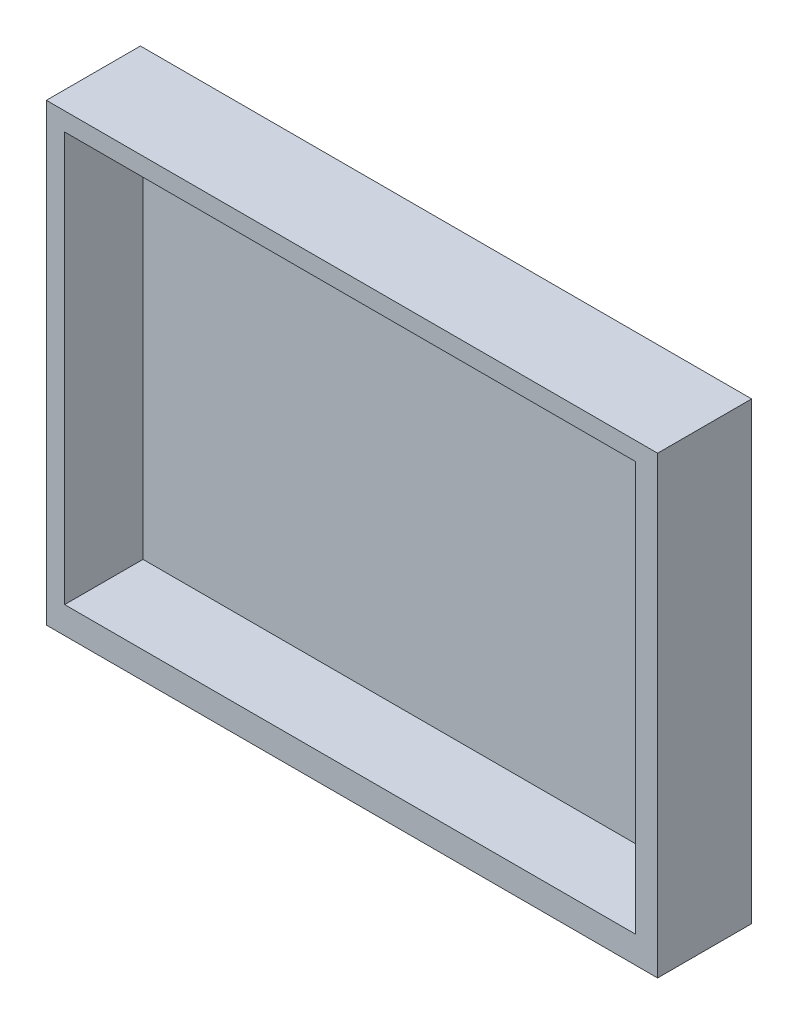
ISO-10303-21;
HEADER;
FILE_DESCRIPTION(('STEP AP214'),'2;1');
FILE_NAME('part.step','',(''),(''),'','','');
FILE_SCHEMA(('AUTOMOTIVE_DESIGN { 1 0 10303 214 1 1 1 1 }'));
ENDSEC;
DATA;
#1=APPLICATION_CONTEXT('core data for automotive mechanical design processes');
#2=APPLICATION_PROTOCOL_DEFINITION('international standard','automotive_design',2000,#1);
#3=PRODUCT_CONTEXT('',#1,'mechanical');
#4=PRODUCT('Part','Part','',(#3));
#5=PRODUCT_RELATED_PRODUCT_CATEGORY('part','',(#4));
#6=PRODUCT_DEFINITION_FORMATION('','',#4);
#7=PRODUCT_DEFINITION_CONTEXT('part definition',#1,'design');
#8=PRODUCT_DEFINITION('design','',#6,#7);
#9=PRODUCT_DEFINITION_SHAPE('','',#8);
#10=(LENGTH_UNIT() NAMED_UNIT(*) SI_UNIT(.MILLI.,.METRE.));
#11=(NAMED_UNIT(*) PLANE_ANGLE_UNIT() SI_UNIT($,.RADIAN.));
#12=(NAMED_UNIT(*) SI_UNIT($,.STERADIAN.) SOLID_ANGLE_UNIT());
#13=UNCERTAINTY_MEASURE_WITH_UNIT(LENGTH_MEASURE(1.E-05),#10,'distance_accuracy_value','');
#14=(GEOMETRIC_REPRESENTATION_CONTEXT(3) GLOBAL_UNCERTAINTY_ASSIGNED_CONTEXT((#13)) GLOBAL_UNIT_ASSIGNED_CONTEXT((#10,
#11,#12)) REPRESENTATION_CONTEXT('',''));
#15=CARTESIAN_POINT('',(0.,0.,0.));
#16=DIRECTION('',(0.,0.,1.));
#17=DIRECTION('',(1.,0.,0.));
#18=AXIS2_PLACEMENT_3D('',#15,#16,#17);
#19=CARTESIAN_POINT('',(0.,0.,0.));
#20=DIRECTION('',(0.,0.,1.));
#21=DIRECTION('',(1.,0.,0.));
#22=AXIS2_PLACEMENT_3D('',#19,#20,#21);
#23=PLANE('',#22);
#24=DIRECTION('',(0.,-1.,0.));
#25=VECTOR('',#24,1.);
#26=CARTESIAN_POINT('',(117.,0.,0.));
#27=LINE('',#26,#25);
#28=CARTESIAN_POINT('',(117.,0.,0.));
#29=VERTEX_POINT('',#28);
#30=CARTESIAN_POINT('',(117.,-87.,0.));
#31=VERTEX_POINT('',#30);
#32=EDGE_CURVE('E241',#29,#31,#27,.T.);
#33=ORIENTED_EDGE('',*,*,#32,.T.);
#34=DIRECTION('',(1.,0.,0.));
#35=VECTOR('',#34,1.);
#36=CARTESIAN_POINT('',(0.,-87.,0.));
#37=LINE('',#36,#35);
#38=CARTESIAN_POINT('',(0.,-87.,0.));
#39=VERTEX_POINT('',#38);
#40=EDGE_CURVE('E252',#39,#31,#37,.T.);
#41=ORIENTED_EDGE('',*,*,#40,.F.);
#42=DIRECTION('',(0.,-1.,0.));
#43=VECTOR('',#42,1.);
#44=CARTESIAN_POINT('',(0.,0.,0.));
#45=LINE('',#44,#43);
#46=CARTESIAN_POINT('',(0.,0.,0.));
#47=VERTEX_POINT('',#46);
#48=EDGE_CURVE('E249',#47,#39,#45,.T.);
#49=ORIENTED_EDGE('',*,*,#48,.F.);
#50=DIRECTION('',(1.,0.,0.));
#51=VECTOR('',#50,1.);
#52=CARTESIAN_POINT('',(0.,0.,0.));
#53=LINE('',#52,#51);
#54=EDGE_CURVE('E245',#47,#29,#53,.T.);
#55=ORIENTED_EDGE('',*,*,#54,.T.);
#56=EDGE_LOOP('',(#33,#41,#49,#55));
#57=FACE_BOUND('',#56,.T.);
#58=ADVANCED_FACE('F113',(#57),#23,.F.);
#59=CARTESIAN_POINT('',(0.,0.,3.));
#60=DIRECTION('',(0.,1.,0.));
#61=DIRECTION('',(0.,0.,1.));
#62=AXIS2_PLACEMENT_3D('',#59,#60,#61);
#63=PLANE('',#62);
#64=ORIENTED_EDGE('',*,*,#54,.F.);
#65=DIRECTION('',(0.,0.,-1.));
#66=VECTOR('',#65,1.);
#67=CARTESIAN_POINT('',(0.,0.,3.));
#68=LINE('',#67,#66);
#69=CARTESIAN_POINT('',(0.,0.,18.));
#70=VERTEX_POINT('',#69);
#71=EDGE_CURVE('E122',#70,#47,#68,.T.);
#72=ORIENTED_EDGE('',*,*,#71,.F.);
#73=DIRECTION('',(-1.,0.,0.));
#74=VECTOR('',#73,1.);
#75=CARTESIAN_POINT('',(0.,0.,18.));
#76=LINE('',#75,#74);
#77=CARTESIAN_POINT('',(117.,0.,18.));
#78=VERTEX_POINT('',#77);
#79=EDGE_CURVE('E237',#78,#70,#76,.T.);
#80=ORIENTED_EDGE('',*,*,#79,.F.);
#81=DIRECTION('',(0.,0.,-1.));
#82=VECTOR('',#81,1.);
#83=CARTESIAN_POINT('',(117.,0.,3.));
#84=LINE('',#83,#82);
#85=EDGE_CURVE('E12',#78,#29,#84,.T.);
#86=ORIENTED_EDGE('',*,*,#85,.T.);
#87=EDGE_LOOP('',(#64,#72,#80,#86));
#88=FACE_BOUND('',#87,.T.);
#89=ADVANCED_FACE('F272',(#88),#63,.T.);
#90=CARTESIAN_POINT('',(0.,0.,3.));
#91=DIRECTION('',(1.,0.,0.));
#92=DIRECTION('',(0.,1.,0.));
#93=AXIS2_PLACEMENT_3D('',#90,#91,#92);
#94=PLANE('',#93);
#95=ORIENTED_EDGE('',*,*,#48,.T.);
#96=DIRECTION('',(0.,0.,-1.));
#97=VECTOR('',#96,1.);
#98=CARTESIAN_POINT('',(0.,-87.,3.));
#99=LINE('',#98,#97);
#100=CARTESIAN_POINT('',(0.,-87.,18.));
#101=VERTEX_POINT('',#100);
#102=EDGE_CURVE('E259',#101,#39,#99,.T.);
#103=ORIENTED_EDGE('',*,*,#102,.F.);
#104=DIRECTION('',(0.,-1.,0.));
#105=VECTOR('',#104,1.);
#106=CARTESIAN_POINT('',(0.,0.,18.));
#107=LINE('',#106,#105);
#108=EDGE_CURVE('E194',#70,#101,#107,.T.);
#109=ORIENTED_EDGE('',*,*,#108,.F.);
#110=ORIENTED_EDGE('',*,*,#71,.T.);
#111=EDGE_LOOP('',(#95,#103,#109,#110));
#112=FACE_BOUND('',#111,.T.);
#113=ADVANCED_FACE('F266',(#112),#94,.F.);
#114=CARTESIAN_POINT('',(0.,-87.,3.));
#115=DIRECTION('',(0.,1.,0.));
#116=DIRECTION('',(0.,0.,1.));
#117=AXIS2_PLACEMENT_3D('',#114,#115,#116);
#118=PLANE('',#117);
#119=ORIENTED_EDGE('',*,*,#40,.T.);
#120=DIRECTION('',(0.,0.,-1.));
#121=VECTOR('',#120,1.);
#122=CARTESIAN_POINT('',(117.,-87.,3.));
#123=LINE('',#122,#121);
#124=CARTESIAN_POINT('',(117.,-87.,18.));
#125=VERTEX_POINT('',#124);
#126=EDGE_CURVE('E256',#125,#31,#123,.T.);
#127=ORIENTED_EDGE('',*,*,#126,.F.);
#128=DIRECTION('',(1.,0.,0.));
#129=VECTOR('',#128,1.);
#130=CARTESIAN_POINT('',(0.,-87.,18.));
#131=LINE('',#130,#129);
#132=EDGE_CURVE('E229',#101,#125,#131,.T.);
#133=ORIENTED_EDGE('',*,*,#132,.F.);
#134=ORIENTED_EDGE('',*,*,#102,.T.);
#135=EDGE_LOOP('',(#119,#127,#133,#134));
#136=FACE_BOUND('',#135,.T.);
#137=ADVANCED_FACE('F278',(#136),#118,.F.);
#138=CARTESIAN_POINT('',(117.,0.,3.));
#139=DIRECTION('',(1.,0.,0.));
#140=DIRECTION('',(0.,1.,0.));
#141=AXIS2_PLACEMENT_3D('',#138,#139,#140);
#142=PLANE('',#141);
#143=ORIENTED_EDGE('',*,*,#32,.F.);
#144=ORIENTED_EDGE('',*,*,#85,.F.);
#145=DIRECTION('',(0.,1.,0.));
#146=VECTOR('',#145,1.);
#147=CARTESIAN_POINT('',(117.,0.,18.));
#148=LINE('',#147,#146);
#149=EDGE_CURVE('E233',#125,#78,#148,.T.);
#150=ORIENTED_EDGE('',*,*,#149,.F.);
#151=ORIENTED_EDGE('',*,*,#126,.T.);
#152=EDGE_LOOP('',(#143,#144,#150,#151));
#153=FACE_BOUND('',#152,.T.);
#154=ADVANCED_FACE('F115',(#153),#142,.T.);
#155=CARTESIAN_POINT('',(0.,0.,18.));
#156=DIRECTION('',(0.,0.,1.));
#157=DIRECTION('',(1.,0.,0.));
#158=AXIS2_PLACEMENT_3D('',#155,#156,#157);
#159=PLANE('',#158);
#160=ORIENTED_EDGE('',*,*,#108,.T.);
#161=ORIENTED_EDGE('',*,*,#132,.T.);
#162=ORIENTED_EDGE('',*,*,#149,.T.);
#163=ORIENTED_EDGE('',*,*,#79,.T.);
#164=EDGE_LOOP('',(#160,#161,#162,#163));
#165=FACE_BOUND('',#164,.T.);
#166=DIRECTION('',(1.,0.,0.));
#167=VECTOR('',#166,1.);
#168=CARTESIAN_POINT('',(3.50000000000001,-81.85290245044,18.));
#169=LINE('',#168,#167);
#170=CARTESIAN_POINT('',(3.50000000000001,-81.85290245044,18.));
#171=VERTEX_POINT('',#170);
#172=CARTESIAN_POINT('',(112.779406394495,-81.85290245044,18.));
#173=VERTEX_POINT('',#172);
#174=EDGE_CURVE('E187',#171,#173,#169,.T.);
#175=ORIENTED_EDGE('',*,*,#174,.F.);
#176=DIRECTION('',(0.,-1.,0.));
#177=VECTOR('',#176,1.);
#178=CARTESIAN_POINT('',(3.5,-3.5,18.));
#179=LINE('',#178,#177);
#180=CARTESIAN_POINT('',(3.5,-3.5,18.));
#181=VERTEX_POINT('',#180);
#182=EDGE_CURVE('E177',#181,#171,#179,.T.);
#183=ORIENTED_EDGE('',*,*,#182,.F.);
#184=DIRECTION('',(-1.,0.,0.));
#185=VECTOR('',#184,1.);
#186=CARTESIAN_POINT('',(3.5,-3.5,18.));
#187=LINE('',#186,#185);
#188=CARTESIAN_POINT('',(112.779406394495,-3.5,18.));
#189=VERTEX_POINT('',#188);
#190=EDGE_CURVE('E204',#189,#181,#187,.T.);
#191=ORIENTED_EDGE('',*,*,#190,.F.);
#192=DIRECTION('',(0.,1.,0.));
#193=VECTOR('',#192,1.);
#194=CARTESIAN_POINT('',(112.779406394495,-3.5,18.));
#195=LINE('',#194,#193);
#196=EDGE_CURVE('E200',#173,#189,#195,.T.);
#197=ORIENTED_EDGE('',*,*,#196,.F.);
#198=EDGE_LOOP('',(#175,#183,#191,#197));
#199=FACE_BOUND('',#198,.T.);
#200=ADVANCED_FACE('F198',(#165,#199),#159,.T.);
#201=CARTESIAN_POINT('',(3.5,-3.5,18.));
#202=DIRECTION('',(1.,0.,0.));
#203=DIRECTION('',(0.,1.,0.));
#204=AXIS2_PLACEMENT_3D('',#201,#202,#203);
#205=PLANE('',#204);
#206=DIRECTION('',(0.,-1.,0.));
#207=VECTOR('',#206,1.);
#208=CARTESIAN_POINT('',(3.5,-3.5,3.));
#209=LINE('',#208,#207);
#210=CARTESIAN_POINT('',(3.5,-3.5,3.));
#211=VERTEX_POINT('',#210);
#212=CARTESIAN_POINT('',(3.50000000000001,-81.85290245044,3.));
#213=VERTEX_POINT('',#212);
#214=EDGE_CURVE('E129',#211,#213,#209,.T.);
#215=ORIENTED_EDGE('',*,*,#214,.F.);
#216=DIRECTION('',(0.,0.,-1.));
#217=VECTOR('',#216,1.);
#218=CARTESIAN_POINT('',(3.5,-3.5,18.));
#219=LINE('',#218,#217);
#220=EDGE_CURVE('E182',#181,#211,#219,.T.);
#221=ORIENTED_EDGE('',*,*,#220,.F.);
#222=ORIENTED_EDGE('',*,*,#182,.T.);
#223=DIRECTION('',(0.,0.,-1.));
#224=VECTOR('',#223,1.);
#225=CARTESIAN_POINT('',(3.50000000000001,-81.85290245044,18.));
#226=LINE('',#225,#224);
#227=EDGE_CURVE('E180',#171,#213,#226,.T.);
#228=ORIENTED_EDGE('',*,*,#227,.T.);
#229=EDGE_LOOP('',(#215,#221,#222,#228));
#230=FACE_BOUND('',#229,.T.);
#231=ADVANCED_FACE('F179',(#230),#205,.T.);
#232=CARTESIAN_POINT('',(3.50000000000001,-81.85290245044,18.));
#233=DIRECTION('',(0.,1.,0.));
#234=DIRECTION('',(0.,0.,1.));
#235=AXIS2_PLACEMENT_3D('',#232,#233,#234);
#236=PLANE('',#235);
#237=DIRECTION('',(1.,0.,0.));
#238=VECTOR('',#237,1.);
#239=CARTESIAN_POINT('',(3.50000000000001,-81.85290245044,3.));
#240=LINE('',#239,#238);
#241=CARTESIAN_POINT('',(112.779406394495,-81.85290245044,3.));
#242=VERTEX_POINT('',#241);
#243=EDGE_CURVE('E133',#213,#242,#240,.T.);
#244=ORIENTED_EDGE('',*,*,#243,.F.);
#245=ORIENTED_EDGE('',*,*,#227,.F.);
#246=ORIENTED_EDGE('',*,*,#174,.T.);
#247=DIRECTION('',(0.,0.,-1.));
#248=VECTOR('',#247,1.);
#249=CARTESIAN_POINT('',(112.779406394495,-81.85290245044,18.));
#250=LINE('',#249,#248);
#251=EDGE_CURVE('E195',#173,#242,#250,.T.);
#252=ORIENTED_EDGE('',*,*,#251,.T.);
#253=EDGE_LOOP('',(#244,#245,#246,#252));
#254=FACE_BOUND('',#253,.T.);
#255=ADVANCED_FACE('F191',(#254),#236,.T.);
#256=CARTESIAN_POINT('',(112.779406394495,-3.5,18.));
#257=DIRECTION('',(-1.,0.,0.));
#258=DIRECTION('',(0.,-1.,0.));
#259=AXIS2_PLACEMENT_3D('',#256,#257,#258);
#260=PLANE('',#259);
#261=DIRECTION('',(0.,1.,0.));
#262=VECTOR('',#261,1.);
#263=CARTESIAN_POINT('',(112.779406394495,-3.5,3.));
#264=LINE('',#263,#262);
#265=CARTESIAN_POINT('',(112.779406394495,-3.5,3.));
#266=VERTEX_POINT('',#265);
#267=EDGE_CURVE('E213',#242,#266,#264,.T.);
#268=ORIENTED_EDGE('',*,*,#267,.F.);
#269=ORIENTED_EDGE('',*,*,#251,.F.);
#270=ORIENTED_EDGE('',*,*,#196,.T.);
#271=DIRECTION('',(0.,0.,-1.));
#272=VECTOR('',#271,1.);
#273=CARTESIAN_POINT('',(112.779406394495,-3.5,18.));
#274=LINE('',#273,#272);
#275=EDGE_CURVE('E220',#189,#266,#274,.T.);
#276=ORIENTED_EDGE('',*,*,#275,.T.);
#277=EDGE_LOOP('',(#268,#269,#270,#276));
#278=FACE_BOUND('',#277,.T.);
#279=ADVANCED_FACE('F330',(#278),#260,.T.);
#280=CARTESIAN_POINT('',(3.5,-3.5,18.));
#281=DIRECTION('',(0.,-1.,0.));
#282=DIRECTION('',(0.,0.,-1.));
#283=AXIS2_PLACEMENT_3D('',#280,#281,#282);
#284=PLANE('',#283);
#285=DIRECTION('',(-1.,0.,0.));
#286=VECTOR('',#285,1.);
#287=CARTESIAN_POINT('',(3.5,-3.5,3.));
#288=LINE('',#287,#286);
#289=EDGE_CURVE('E188',#266,#211,#288,.T.);
#290=ORIENTED_EDGE('',*,*,#289,.F.);
#291=ORIENTED_EDGE('',*,*,#275,.F.);
#292=ORIENTED_EDGE('',*,*,#190,.T.);
#293=ORIENTED_EDGE('',*,*,#220,.T.);
#294=EDGE_LOOP('',(#290,#291,#292,#293));
#295=FACE_BOUND('',#294,.T.);
#296=ADVANCED_FACE('F339',(#295),#284,.T.);
#297=CARTESIAN_POINT('',(0.,0.,3.));
#298=DIRECTION('',(0.,0.,1.));
#299=DIRECTION('',(1.,0.,0.));
#300=AXIS2_PLACEMENT_3D('',#297,#298,#299);
#301=PLANE('',#300);
#302=ORIENTED_EDGE('',*,*,#214,.T.);
#303=ORIENTED_EDGE('',*,*,#243,.T.);
#304=ORIENTED_EDGE('',*,*,#267,.T.);
#305=ORIENTED_EDGE('',*,*,#289,.T.);
#306=EDGE_LOOP('',(#302,#303,#304,#305));
#307=FACE_BOUND('',#306,.T.);
#308=ADVANCED_FACE('F294',(#307),#301,.T.);
#309=CLOSED_SHELL('',(#58,#89,#113,#137,#154,#200,#231,#255,#279,#296,#308));
#310=MANIFOLD_SOLID_BREP('B2',#309);
#311=ADVANCED_BREP_SHAPE_REPRESENTATION('',(#18,#310),#14);
#312=SHAPE_DEFINITION_REPRESENTATION(#9,#311);
ENDSEC;
END-ISO-10303-21;
